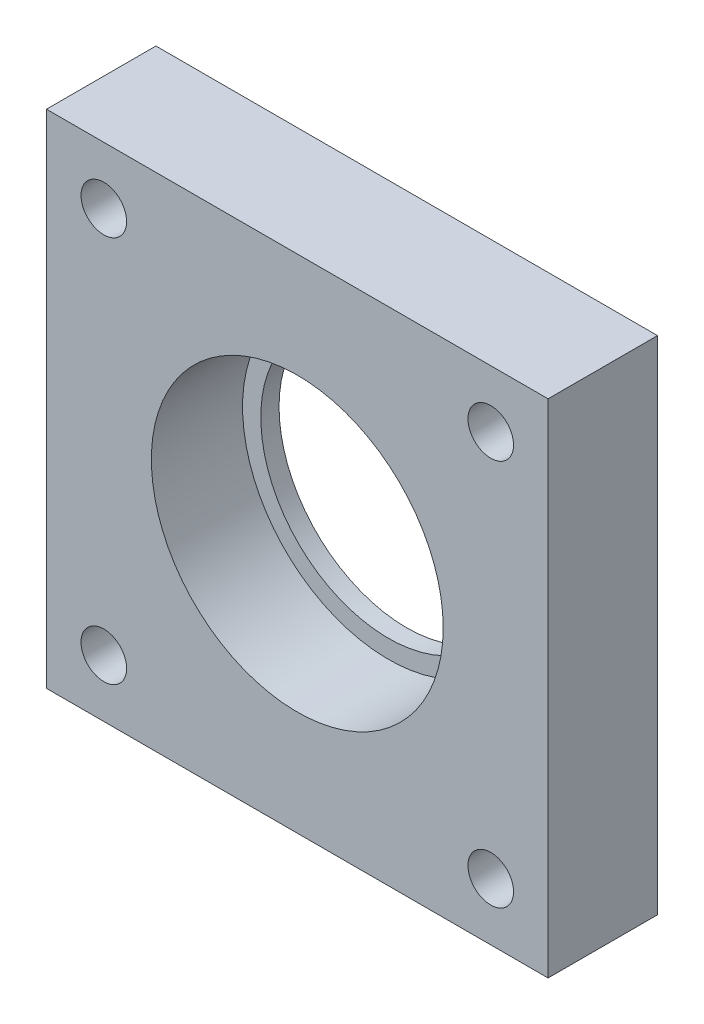
ISO-10303-21;
HEADER;
FILE_DESCRIPTION(('STEP AP214'),'2;1');
FILE_NAME('part.step','',(''),(''),'','','');
FILE_SCHEMA(('AUTOMOTIVE_DESIGN { 1 0 10303 214 1 1 1 1 }'));
ENDSEC;
DATA;
#1=APPLICATION_CONTEXT('core data for automotive mechanical design processes');
#2=APPLICATION_PROTOCOL_DEFINITION('international standard','automotive_design',2000,#1);
#3=PRODUCT_CONTEXT('',#1,'mechanical');
#4=PRODUCT('Part','Part','',(#3));
#5=PRODUCT_RELATED_PRODUCT_CATEGORY('part','',(#4));
#6=PRODUCT_DEFINITION_FORMATION('','',#4);
#7=PRODUCT_DEFINITION_CONTEXT('part definition',#1,'design');
#8=PRODUCT_DEFINITION('design','',#6,#7);
#9=PRODUCT_DEFINITION_SHAPE('','',#8);
#10=(LENGTH_UNIT() NAMED_UNIT(*) SI_UNIT(.MILLI.,.METRE.));
#11=(NAMED_UNIT(*) PLANE_ANGLE_UNIT() SI_UNIT($,.RADIAN.));
#12=(NAMED_UNIT(*) SI_UNIT($,.STERADIAN.) SOLID_ANGLE_UNIT());
#13=UNCERTAINTY_MEASURE_WITH_UNIT(LENGTH_MEASURE(1.E-05),#10,'distance_accuracy_value','');
#14=(GEOMETRIC_REPRESENTATION_CONTEXT(3) GLOBAL_UNCERTAINTY_ASSIGNED_CONTEXT((#13)) GLOBAL_UNIT_ASSIGNED_CONTEXT((#10,
#11,#12)) REPRESENTATION_CONTEXT('',''));
#15=CARTESIAN_POINT('',(0.,0.,0.));
#16=DIRECTION('',(0.,0.,1.));
#17=DIRECTION('',(1.,0.,0.));
#18=AXIS2_PLACEMENT_3D('',#15,#16,#17);
#19=CARTESIAN_POINT('',(0.,0.,-12.));
#20=DIRECTION('',(-1.,0.,0.));
#21=DIRECTION('',(0.,0.,1.));
#22=AXIS2_PLACEMENT_3D('',#19,#20,#21);
#23=PLANE('',#22);
#24=DIRECTION('',(0.,-1.,0.));
#25=VECTOR('',#24,1.);
#26=CARTESIAN_POINT('',(0.,0.,0.));
#27=LINE('',#26,#25);
#28=CARTESIAN_POINT('',(0.,55.,0.));
#29=VERTEX_POINT('',#28);
#30=CARTESIAN_POINT('',(0.,0.,0.));
#31=VERTEX_POINT('',#30);
#32=EDGE_CURVE('E98',#29,#31,#27,.T.);
#33=ORIENTED_EDGE('',*,*,#32,.F.);
#34=DIRECTION('',(0.,0.,1.));
#35=VECTOR('',#34,1.);
#36=CARTESIAN_POINT('',(0.,55.,-12.));
#37=LINE('',#36,#35);
#38=CARTESIAN_POINT('',(0.,55.,-12.));
#39=VERTEX_POINT('',#38);
#40=EDGE_CURVE('E11',#39,#29,#37,.T.);
#41=ORIENTED_EDGE('',*,*,#40,.F.);
#42=DIRECTION('',(0.,-1.,0.));
#43=VECTOR('',#42,1.);
#44=CARTESIAN_POINT('',(0.,0.,-12.));
#45=LINE('',#44,#43);
#46=CARTESIAN_POINT('',(0.,0.,-12.));
#47=VERTEX_POINT('',#46);
#48=EDGE_CURVE('E91',#39,#47,#45,.T.);
#49=ORIENTED_EDGE('',*,*,#48,.T.);
#50=DIRECTION('',(0.,0.,1.));
#51=VECTOR('',#50,1.);
#52=CARTESIAN_POINT('',(0.,0.,-12.));
#53=LINE('',#52,#51);
#54=EDGE_CURVE('E36',#47,#31,#53,.T.);
#55=ORIENTED_EDGE('',*,*,#54,.T.);
#56=EDGE_LOOP('',(#33,#41,#49,#55));
#57=FACE_BOUND('',#56,.T.);
#58=ADVANCED_FACE('F33',(#57),#23,.T.);
#59=CARTESIAN_POINT('',(0.,55.,-12.));
#60=DIRECTION('',(0.,1.,0.));
#61=DIRECTION('',(0.,0.,1.));
#62=AXIS2_PLACEMENT_3D('',#59,#60,#61);
#63=PLANE('',#62);
#64=DIRECTION('',(-1.,0.,0.));
#65=VECTOR('',#64,1.);
#66=CARTESIAN_POINT('',(0.,55.,0.));
#67=LINE('',#66,#65);
#68=CARTESIAN_POINT('',(55.,55.,0.));
#69=VERTEX_POINT('',#68);
#70=EDGE_CURVE('E93',#69,#29,#67,.T.);
#71=ORIENTED_EDGE('',*,*,#70,.F.);
#72=DIRECTION('',(0.,0.,1.));
#73=VECTOR('',#72,1.);
#74=CARTESIAN_POINT('',(55.,55.,-12.));
#75=LINE('',#74,#73);
#76=CARTESIAN_POINT('',(55.,55.,-12.));
#77=VERTEX_POINT('',#76);
#78=EDGE_CURVE('E42',#77,#69,#75,.T.);
#79=ORIENTED_EDGE('',*,*,#78,.F.);
#80=DIRECTION('',(-1.,0.,0.));
#81=VECTOR('',#80,1.);
#82=CARTESIAN_POINT('',(0.,55.,-12.));
#83=LINE('',#82,#81);
#84=EDGE_CURVE('E88',#77,#39,#83,.T.);
#85=ORIENTED_EDGE('',*,*,#84,.T.);
#86=ORIENTED_EDGE('',*,*,#40,.T.);
#87=EDGE_LOOP('',(#71,#79,#85,#86));
#88=FACE_BOUND('',#87,.T.);
#89=ADVANCED_FACE('F109',(#88),#63,.T.);
#90=CARTESIAN_POINT('',(55.,0.,-12.));
#91=DIRECTION('',(1.,0.,0.));
#92=DIRECTION('',(0.,0.,-1.));
#93=AXIS2_PLACEMENT_3D('',#90,#91,#92);
#94=PLANE('',#93);
#95=DIRECTION('',(0.,1.,0.));
#96=VECTOR('',#95,1.);
#97=CARTESIAN_POINT('',(55.,0.,0.));
#98=LINE('',#97,#96);
#99=CARTESIAN_POINT('',(55.,0.,0.));
#100=VERTEX_POINT('',#99);
#101=EDGE_CURVE('E83',#100,#69,#98,.T.);
#102=ORIENTED_EDGE('',*,*,#101,.F.);
#103=DIRECTION('',(0.,0.,1.));
#104=VECTOR('',#103,1.);
#105=CARTESIAN_POINT('',(55.,0.,-12.));
#106=LINE('',#105,#104);
#107=CARTESIAN_POINT('',(55.,0.,-12.));
#108=VERTEX_POINT('',#107);
#109=EDGE_CURVE('E78',#108,#100,#106,.T.);
#110=ORIENTED_EDGE('',*,*,#109,.F.);
#111=DIRECTION('',(0.,1.,0.));
#112=VECTOR('',#111,1.);
#113=CARTESIAN_POINT('',(55.,0.,-12.));
#114=LINE('',#113,#112);
#115=EDGE_CURVE('E81',#108,#77,#114,.T.);
#116=ORIENTED_EDGE('',*,*,#115,.T.);
#117=ORIENTED_EDGE('',*,*,#78,.T.);
#118=EDGE_LOOP('',(#102,#110,#116,#117));
#119=FACE_BOUND('',#118,.T.);
#120=ADVANCED_FACE('F80',(#119),#94,.T.);
#121=CARTESIAN_POINT('',(0.,0.,-12.));
#122=DIRECTION('',(0.,-1.,0.));
#123=DIRECTION('',(0.,0.,-1.));
#124=AXIS2_PLACEMENT_3D('',#121,#122,#123);
#125=PLANE('',#124);
#126=DIRECTION('',(1.,0.,0.));
#127=VECTOR('',#126,1.);
#128=CARTESIAN_POINT('',(0.,0.,0.));
#129=LINE('',#128,#127);
#130=EDGE_CURVE('E101',#31,#100,#129,.T.);
#131=ORIENTED_EDGE('',*,*,#130,.F.);
#132=ORIENTED_EDGE('',*,*,#54,.F.);
#133=DIRECTION('',(1.,0.,0.));
#134=VECTOR('',#133,1.);
#135=CARTESIAN_POINT('',(0.,0.,-12.));
#136=LINE('',#135,#134);
#137=EDGE_CURVE('E87',#47,#108,#136,.T.);
#138=ORIENTED_EDGE('',*,*,#137,.T.);
#139=ORIENTED_EDGE('',*,*,#109,.T.);
#140=EDGE_LOOP('',(#131,#132,#138,#139));
#141=FACE_BOUND('',#140,.T.);
#142=ADVANCED_FACE('F90',(#141),#125,.T.);
#143=CARTESIAN_POINT('',(0.,0.,-12.));
#144=DIRECTION('',(0.,0.,-1.));
#145=DIRECTION('',(-1.,0.,0.));
#146=AXIS2_PLACEMENT_3D('',#143,#144,#145);
#147=PLANE('',#146);
#148=CARTESIAN_POINT('',(6.28679656440357,6.28679656440357,-12.));
#149=DIRECTION('',(0.,0.,-1.));
#150=DIRECTION('',(-1.,0.,0.));
#151=AXIS2_PLACEMENT_3D('',#148,#149,#150);
#152=CIRCLE('',#151,2.5);
#153=CARTESIAN_POINT('',(3.78679656440357,6.28679656440357,-12.));
#154=VERTEX_POINT('',#153);
#155=EDGE_CURVE('E165',#154,#154,#152,.T.);
#156=ORIENTED_EDGE('',*,*,#155,.F.);
#157=EDGE_LOOP('',(#156));
#158=FACE_BOUND('',#157,.T.);
#159=CARTESIAN_POINT('',(48.7132034355964,6.28679656440356,-12.));
#160=DIRECTION('',(0.,0.,-1.));
#161=DIRECTION('',(1.,0.,0.));
#162=AXIS2_PLACEMENT_3D('',#159,#160,#161);
#163=CIRCLE('',#162,2.5);
#164=CARTESIAN_POINT('',(51.2132034355964,6.28679656440356,-12.));
#165=VERTEX_POINT('',#164);
#166=EDGE_CURVE('E167',#165,#165,#163,.T.);
#167=ORIENTED_EDGE('',*,*,#166,.F.);
#168=EDGE_LOOP('',(#167));
#169=FACE_BOUND('',#168,.T.);
#170=CARTESIAN_POINT('',(6.28679656440358,48.7132034355964,-12.));
#171=DIRECTION('',(0.,0.,-1.));
#172=DIRECTION('',(1.,0.,0.));
#173=AXIS2_PLACEMENT_3D('',#170,#171,#172);
#174=CIRCLE('',#173,2.5);
#175=CARTESIAN_POINT('',(8.78679656440358,48.7132034355964,-12.));
#176=VERTEX_POINT('',#175);
#177=EDGE_CURVE('E173',#176,#176,#174,.T.);
#178=ORIENTED_EDGE('',*,*,#177,.F.);
#179=EDGE_LOOP('',(#178));
#180=FACE_BOUND('',#179,.T.);
#181=CARTESIAN_POINT('',(48.7132034355964,48.7132034355964,-12.));
#182=DIRECTION('',(0.,0.,-1.));
#183=DIRECTION('',(-1.,0.,0.));
#184=AXIS2_PLACEMENT_3D('',#181,#182,#183);
#185=CIRCLE('',#184,2.5);
#186=CARTESIAN_POINT('',(46.2132034355964,48.7132034355964,-12.));
#187=VERTEX_POINT('',#186);
#188=EDGE_CURVE('E179',#187,#187,#185,.T.);
#189=ORIENTED_EDGE('',*,*,#188,.F.);
#190=EDGE_LOOP('',(#189));
#191=FACE_BOUND('',#190,.T.);
#192=CARTESIAN_POINT('',(27.5,27.5,-12.));
#193=DIRECTION('',(0.,0.,-1.));
#194=DIRECTION('',(-1.,0.,0.));
#195=AXIS2_PLACEMENT_3D('',#192,#193,#194);
#196=CIRCLE('',#195,14.);
#197=CARTESIAN_POINT('',(13.5,27.5,-12.));
#198=VERTEX_POINT('',#197);
#199=EDGE_CURVE('E190',#198,#198,#196,.T.);
#200=ORIENTED_EDGE('',*,*,#199,.F.);
#201=EDGE_LOOP('',(#200));
#202=FACE_BOUND('',#201,.T.);
#203=ORIENTED_EDGE('',*,*,#48,.F.);
#204=ORIENTED_EDGE('',*,*,#84,.F.);
#205=ORIENTED_EDGE('',*,*,#115,.F.);
#206=ORIENTED_EDGE('',*,*,#137,.F.);
#207=EDGE_LOOP('',(#203,#204,#205,#206));
#208=FACE_BOUND('',#207,.T.);
#209=ADVANCED_FACE('F86',(#158,#169,#180,#191,#202,#208),#147,.T.);
#210=CARTESIAN_POINT('',(0.,0.,0.));
#211=DIRECTION('',(0.,0.,-1.));
#212=DIRECTION('',(-1.,0.,0.));
#213=AXIS2_PLACEMENT_3D('',#210,#211,#212);
#214=PLANE('',#213);
#215=CARTESIAN_POINT('',(6.28679656440357,6.28679656440357,0.));
#216=DIRECTION('',(0.,0.,-1.));
#217=DIRECTION('',(-1.,0.,0.));
#218=AXIS2_PLACEMENT_3D('',#215,#216,#217);
#219=CIRCLE('',#218,2.5);
#220=CARTESIAN_POINT('',(3.78679656440357,6.28679656440357,0.));
#221=VERTEX_POINT('',#220);
#222=EDGE_CURVE('E163',#221,#221,#219,.T.);
#223=ORIENTED_EDGE('',*,*,#222,.T.);
#224=EDGE_LOOP('',(#223));
#225=FACE_BOUND('',#224,.T.);
#226=CARTESIAN_POINT('',(48.7132034355964,6.28679656440356,0.));
#227=DIRECTION('',(0.,0.,-1.));
#228=DIRECTION('',(1.,0.,0.));
#229=AXIS2_PLACEMENT_3D('',#226,#227,#228);
#230=CIRCLE('',#229,2.5);
#231=CARTESIAN_POINT('',(51.2132034355964,6.28679656440356,0.));
#232=VERTEX_POINT('',#231);
#233=EDGE_CURVE('E170',#232,#232,#230,.T.);
#234=ORIENTED_EDGE('',*,*,#233,.T.);
#235=EDGE_LOOP('',(#234));
#236=FACE_BOUND('',#235,.T.);
#237=CARTESIAN_POINT('',(6.28679656440358,48.7132034355964,0.));
#238=DIRECTION('',(0.,0.,-1.));
#239=DIRECTION('',(1.,0.,0.));
#240=AXIS2_PLACEMENT_3D('',#237,#238,#239);
#241=CIRCLE('',#240,2.5);
#242=CARTESIAN_POINT('',(8.78679656440358,48.7132034355964,0.));
#243=VERTEX_POINT('',#242);
#244=EDGE_CURVE('E176',#243,#243,#241,.T.);
#245=ORIENTED_EDGE('',*,*,#244,.T.);
#246=EDGE_LOOP('',(#245));
#247=FACE_BOUND('',#246,.T.);
#248=CARTESIAN_POINT('',(48.7132034355964,48.7132034355964,0.));
#249=DIRECTION('',(0.,0.,-1.));
#250=DIRECTION('',(-1.,0.,0.));
#251=AXIS2_PLACEMENT_3D('',#248,#249,#250);
#252=CIRCLE('',#251,2.5);
#253=CARTESIAN_POINT('',(46.2132034355964,48.7132034355964,0.));
#254=VERTEX_POINT('',#253);
#255=EDGE_CURVE('E182',#254,#254,#252,.T.);
#256=ORIENTED_EDGE('',*,*,#255,.T.);
#257=EDGE_LOOP('',(#256));
#258=FACE_BOUND('',#257,.T.);
#259=CARTESIAN_POINT('',(27.5,27.5,0.));
#260=DIRECTION('',(0.,0.,1.));
#261=DIRECTION('',(1.,0.,0.));
#262=AXIS2_PLACEMENT_3D('',#259,#260,#261);
#263=CIRCLE('',#262,16.);
#264=CARTESIAN_POINT('',(43.5,27.5,0.));
#265=VERTEX_POINT('',#264);
#266=EDGE_CURVE('E193',#265,#265,#263,.T.);
#267=ORIENTED_EDGE('',*,*,#266,.F.);
#268=EDGE_LOOP('',(#267));
#269=FACE_BOUND('',#268,.T.);
#270=ORIENTED_EDGE('',*,*,#32,.T.);
#271=ORIENTED_EDGE('',*,*,#130,.T.);
#272=ORIENTED_EDGE('',*,*,#101,.T.);
#273=ORIENTED_EDGE('',*,*,#70,.T.);
#274=EDGE_LOOP('',(#270,#271,#272,#273));
#275=FACE_BOUND('',#274,.T.);
#276=ADVANCED_FACE('F108',(#225,#236,#247,#258,#269,#275),#214,.F.);
#277=CARTESIAN_POINT('',(27.5,27.5,-10.));
#278=DIRECTION('',(0.,0.,1.));
#279=DIRECTION('',(1.,0.,0.));
#280=AXIS2_PLACEMENT_3D('',#277,#278,#279);
#281=CYLINDRICAL_SURFACE('',#280,16.);
#282=CARTESIAN_POINT('',(27.5,27.5,-10.));
#283=DIRECTION('',(0.,0.,1.));
#284=DIRECTION('',(1.,0.,0.));
#285=AXIS2_PLACEMENT_3D('',#282,#283,#284);
#286=CIRCLE('',#285,16.);
#287=CARTESIAN_POINT('',(43.5,27.5,-10.));
#288=VERTEX_POINT('',#287);
#289=EDGE_CURVE('E102',#288,#288,#286,.T.);
#290=ORIENTED_EDGE('',*,*,#289,.F.);
#291=EDGE_LOOP('',(#290));
#292=FACE_BOUND('',#291,.T.);
#293=ORIENTED_EDGE('',*,*,#266,.T.);
#294=EDGE_LOOP('',(#293));
#295=FACE_BOUND('',#294,.T.);
#296=ADVANCED_FACE('F127',(#292,#295),#281,.F.);
#297=CARTESIAN_POINT('',(27.5,27.5,-10.));
#298=DIRECTION('',(0.,0.,1.));
#299=DIRECTION('',(1.,0.,0.));
#300=AXIS2_PLACEMENT_3D('',#297,#298,#299);
#301=PLANE('',#300);
#302=CARTESIAN_POINT('',(27.5,27.5,-10.));
#303=DIRECTION('',(0.,0.,1.));
#304=DIRECTION('',(1.,0.,0.));
#305=AXIS2_PLACEMENT_3D('',#302,#303,#304);
#306=CIRCLE('',#305,14.);
#307=CARTESIAN_POINT('',(41.5,27.5,-10.));
#308=VERTEX_POINT('',#307);
#309=EDGE_CURVE('E185',#308,#308,#306,.T.);
#310=ORIENTED_EDGE('',*,*,#309,.F.);
#311=EDGE_LOOP('',(#310));
#312=FACE_BOUND('',#311,.T.);
#313=ORIENTED_EDGE('',*,*,#289,.T.);
#314=EDGE_LOOP('',(#313));
#315=FACE_BOUND('',#314,.T.);
#316=ADVANCED_FACE('F134',(#312,#315),#301,.T.);
#317=CARTESIAN_POINT('',(27.5,27.5,-20.));
#318=DIRECTION('',(0.,0.,1.));
#319=DIRECTION('',(1.,0.,0.));
#320=AXIS2_PLACEMENT_3D('',#317,#318,#319);
#321=CYLINDRICAL_SURFACE('',#320,14.);
#322=ORIENTED_EDGE('',*,*,#199,.T.);
#323=EDGE_LOOP('',(#322));
#324=FACE_BOUND('',#323,.T.);
#325=ORIENTED_EDGE('',*,*,#309,.T.);
#326=EDGE_LOOP('',(#325));
#327=FACE_BOUND('',#326,.T.);
#328=ADVANCED_FACE('F138',(#324,#327),#321,.F.);
#329=CARTESIAN_POINT('',(48.7132034355964,48.7132034355964,0.));
#330=DIRECTION('',(0.,0.,-1.));
#331=DIRECTION('',(-1.,0.,0.));
#332=AXIS2_PLACEMENT_3D('',#329,#330,#331);
#333=CYLINDRICAL_SURFACE('',#332,2.5);
#334=ORIENTED_EDGE('',*,*,#255,.F.);
#335=EDGE_LOOP('',(#334));
#336=FACE_BOUND('',#335,.T.);
#337=ORIENTED_EDGE('',*,*,#188,.T.);
#338=EDGE_LOOP('',(#337));
#339=FACE_BOUND('',#338,.T.);
#340=ADVANCED_FACE('F142',(#336,#339),#333,.F.);
#341=CARTESIAN_POINT('',(6.28679656440358,48.7132034355964,0.));
#342=DIRECTION('',(0.,0.,-1.));
#343=DIRECTION('',(-1.,0.,0.));
#344=AXIS2_PLACEMENT_3D('',#341,#342,#343);
#345=CYLINDRICAL_SURFACE('',#344,2.5);
#346=ORIENTED_EDGE('',*,*,#244,.F.);
#347=EDGE_LOOP('',(#346));
#348=FACE_BOUND('',#347,.T.);
#349=ORIENTED_EDGE('',*,*,#177,.T.);
#350=EDGE_LOOP('',(#349));
#351=FACE_BOUND('',#350,.T.);
#352=ADVANCED_FACE('F146',(#348,#351),#345,.F.);
#353=CARTESIAN_POINT('',(48.7132034355964,6.28679656440356,0.));
#354=DIRECTION('',(0.,0.,-1.));
#355=DIRECTION('',(-1.,0.,0.));
#356=AXIS2_PLACEMENT_3D('',#353,#354,#355);
#357=CYLINDRICAL_SURFACE('',#356,2.5);
#358=ORIENTED_EDGE('',*,*,#233,.F.);
#359=EDGE_LOOP('',(#358));
#360=FACE_BOUND('',#359,.T.);
#361=ORIENTED_EDGE('',*,*,#166,.T.);
#362=EDGE_LOOP('',(#361));
#363=FACE_BOUND('',#362,.T.);
#364=ADVANCED_FACE('F150',(#360,#363),#357,.F.);
#365=CARTESIAN_POINT('',(6.28679656440357,6.28679656440357,0.));
#366=DIRECTION('',(0.,0.,-1.));
#367=DIRECTION('',(-1.,0.,0.));
#368=AXIS2_PLACEMENT_3D('',#365,#366,#367);
#369=CYLINDRICAL_SURFACE('',#368,2.5);
#370=ORIENTED_EDGE('',*,*,#222,.F.);
#371=EDGE_LOOP('',(#370));
#372=FACE_BOUND('',#371,.T.);
#373=ORIENTED_EDGE('',*,*,#155,.T.);
#374=EDGE_LOOP('',(#373));
#375=FACE_BOUND('',#374,.T.);
#376=ADVANCED_FACE('F154',(#372,#375),#369,.F.);
#377=CLOSED_SHELL('',(#58,#89,#120,#142,#209,#276,#296,#316,#328,#340,#352,#364,#376));
#378=MANIFOLD_SOLID_BREP('B2',#377);
#379=ADVANCED_BREP_SHAPE_REPRESENTATION('',(#18,#378),#14);
#380=SHAPE_DEFINITION_REPRESENTATION(#9,#379);
ENDSEC;
END-ISO-10303-21;
